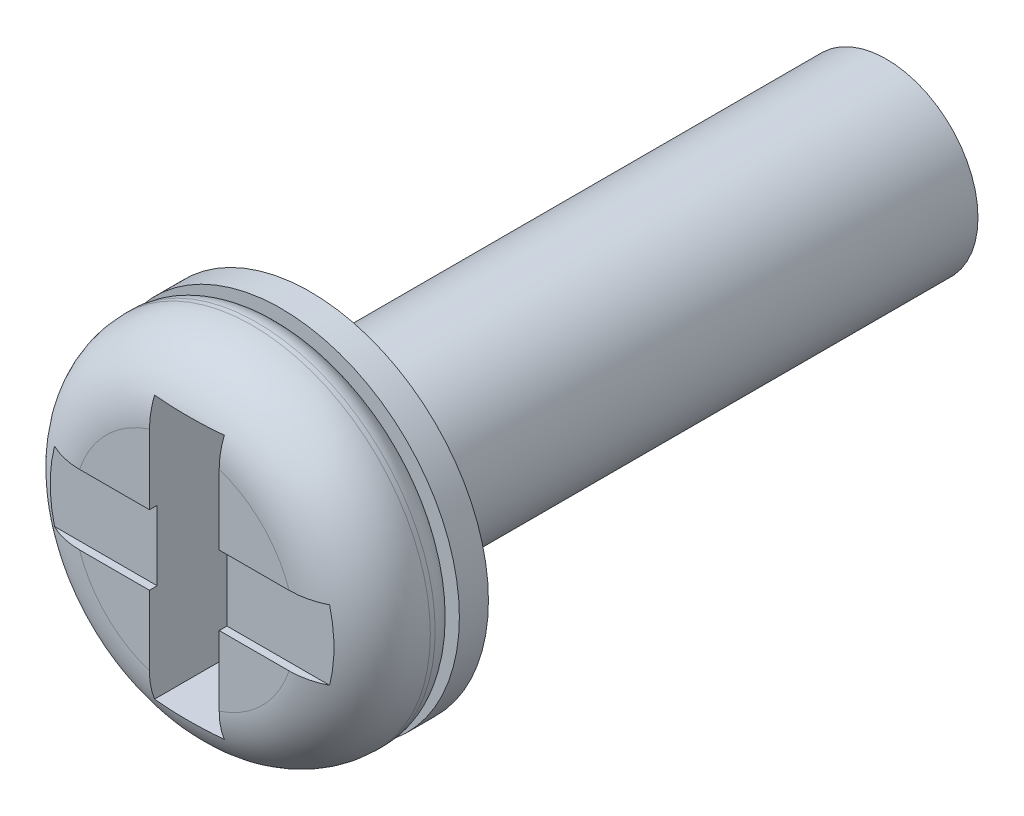
ISO-10303-21;
HEADER;
FILE_DESCRIPTION(('STEP AP214'),'2;1');
FILE_NAME('part.step','',(''),(''),'','','');
FILE_SCHEMA(('AUTOMOTIVE_DESIGN { 1 0 10303 214 1 1 1 1 }'));
ENDSEC;
DATA;
#1=APPLICATION_CONTEXT('core data for automotive mechanical design processes');
#2=APPLICATION_PROTOCOL_DEFINITION('international standard','automotive_design',2000,#1);
#3=PRODUCT_CONTEXT('',#1,'mechanical');
#4=PRODUCT('Part','Part','',(#3));
#5=PRODUCT_RELATED_PRODUCT_CATEGORY('part','',(#4));
#6=PRODUCT_DEFINITION_FORMATION('','',#4);
#7=PRODUCT_DEFINITION_CONTEXT('part definition',#1,'design');
#8=PRODUCT_DEFINITION('design','',#6,#7);
#9=PRODUCT_DEFINITION_SHAPE('','',#8);
#10=(LENGTH_UNIT() NAMED_UNIT(*) SI_UNIT(.MILLI.,.METRE.));
#11=(NAMED_UNIT(*) PLANE_ANGLE_UNIT() SI_UNIT($,.RADIAN.));
#12=(NAMED_UNIT(*) SI_UNIT($,.STERADIAN.) SOLID_ANGLE_UNIT());
#13=UNCERTAINTY_MEASURE_WITH_UNIT(LENGTH_MEASURE(1.E-05),#10,'distance_accuracy_value','');
#14=(GEOMETRIC_REPRESENTATION_CONTEXT(3) GLOBAL_UNCERTAINTY_ASSIGNED_CONTEXT((#13)) GLOBAL_UNIT_ASSIGNED_CONTEXT((#10,
#11,#12)) REPRESENTATION_CONTEXT('',''));
#15=CARTESIAN_POINT('',(0.,0.,0.));
#16=DIRECTION('',(0.,0.,1.));
#17=DIRECTION('',(1.,0.,0.));
#18=AXIS2_PLACEMENT_3D('',#15,#16,#17);
#19=CARTESIAN_POINT('',(-15.875,-0.9144,5.12843787721123));
#20=DIRECTION('',(0.,-1.,0.));
#21=DIRECTION('',(0.,0.,-1.));
#22=AXIS2_PLACEMENT_3D('',#19,#20,#21);
#23=PLANE('',#22);
#24=DIRECTION('',(0.,0.,1.));
#25=VECTOR('',#24,1.);
#26=CARTESIAN_POINT('',(-0.9144,-0.9144,0.127));
#27=LINE('',#26,#25);
#28=CARTESIAN_POINT('',(-0.9144,-0.9144,2.54));
#29=VERTEX_POINT('',#28);
#30=CARTESIAN_POINT('',(-0.9144,-0.9144,2.3368));
#31=VERTEX_POINT('',#30);
#32=EDGE_CURVE('E135',#29,#31,#27,.F.);
#33=ORIENTED_EDGE('',*,*,#32,.T.);
#34=DIRECTION('',(-1.,0.,0.));
#35=VECTOR('',#34,1.);
#36=CARTESIAN_POINT('',(-15.875,-0.9144,2.3368));
#37=LINE('',#36,#35);
#38=CARTESIAN_POINT('',(-3.60690043816391,-0.9144,2.3368));
#39=VERTEX_POINT('',#38);
#40=EDGE_CURVE('E133',#31,#39,#37,.T.);
#41=ORIENTED_EDGE('',*,*,#40,.T.);
#42=CARTESIAN_POINT('',(-2.74743007190356,-0.914400000000001,2.54));
#43=CARTESIAN_POINT('',(-2.80124673868457,-0.9144,2.54000705825152));
#44=CARTESIAN_POINT('',(-2.85506989182567,-0.9144,2.53780042515122));
#45=CARTESIAN_POINT('',(-2.96238479467093,-0.9144,2.52892804109375));
#46=CARTESIAN_POINT('',(-3.01587628400418,-0.9144,2.52225914777365));
#47=CARTESIAN_POINT('',(-3.12106363377137,-0.9144,2.50460544533486));
#48=CARTESIAN_POINT('',(-3.17277412875175,-0.9144,2.49370794851066));
#49=CARTESIAN_POINT('',(-3.27507163677224,-0.9144,2.46762392294327));
#50=CARTESIAN_POINT('',(-3.32565933784672,-0.914400000000002,2.4524401037243));
#51=CARTESIAN_POINT('',(-3.4149723127263,-0.914400000000001,2.42144536094071));
#52=CARTESIAN_POINT('',(-3.45397342316214,-0.914400000000001,2.40642399511154));
#53=CARTESIAN_POINT('',(-3.53117351121653,-0.914399999999999,2.37364827885271));
#54=CARTESIAN_POINT('',(-3.56936372131527,-0.914399999999999,2.35587328129123));
#55=CARTESIAN_POINT('',(-3.60690043816391,-0.914400000000001,2.3368));
#56=B_SPLINE_CURVE_WITH_KNOTS('',3,(#42,#43,#44,#45,#46,#47,#48,#49,#50,#51,#52,#53,#54,#55),
.UNSPECIFIED.,.F.,.F.,(4,2,2,2,2,2,4),(0.,0.161414756760769,0.322943303013079,0.481300299496753,
0.63955741665452,0.76484678036644,0.891125630689563),.UNSPECIFIED.);
#57=CARTESIAN_POINT('',(-2.74743007190356,-0.9144,2.54));
#58=VERTEX_POINT('',#57);
#59=EDGE_CURVE('E122',#58,#39,#56,.T.);
#60=ORIENTED_EDGE('',*,*,#59,.F.);
#61=DIRECTION('',(-1.,0.,0.));
#62=VECTOR('',#61,1.);
#63=CARTESIAN_POINT('',(-4.6736,-0.9144,2.54));
#64=LINE('',#63,#62);
#65=EDGE_CURVE('E443',#58,#29,#64,.F.);
#66=ORIENTED_EDGE('',*,*,#65,.T.);
#67=EDGE_LOOP('',(#33,#41,#60,#66));
#68=FACE_BOUND('',#67,.T.);
#69=ADVANCED_FACE('F17',(#68),#23,.F.);
#70=CARTESIAN_POINT('',(-15.875,0.9144,5.12843787721123));
#71=DIRECTION('',(0.,1.,0.));
#72=DIRECTION('',(0.,0.,1.));
#73=AXIS2_PLACEMENT_3D('',#70,#71,#72);
#74=PLANE('',#73);
#75=DIRECTION('',(0.,0.,1.));
#76=VECTOR('',#75,1.);
#77=CARTESIAN_POINT('',(-0.9144,0.9144,0.127));
#78=LINE('',#77,#76);
#79=CARTESIAN_POINT('',(-0.9144,0.9144,2.3368));
#80=VERTEX_POINT('',#79);
#81=CARTESIAN_POINT('',(-0.9144,0.9144,2.54));
#82=VERTEX_POINT('',#81);
#83=EDGE_CURVE('E397',#80,#82,#78,.T.);
#84=ORIENTED_EDGE('',*,*,#83,.T.);
#85=DIRECTION('',(-1.,0.,0.));
#86=VECTOR('',#85,1.);
#87=CARTESIAN_POINT('',(-4.6736,0.9144,2.54));
#88=LINE('',#87,#86);
#89=CARTESIAN_POINT('',(-2.74743007190356,0.9144,2.54));
#90=VERTEX_POINT('',#89);
#91=EDGE_CURVE('E267',#82,#90,#88,.T.);
#92=ORIENTED_EDGE('',*,*,#91,.T.);
#93=CARTESIAN_POINT('',(-3.60690043816391,0.9144,2.3368));
#94=CARTESIAN_POINT('',(-3.55891645104512,0.9144,2.36118690758039));
#95=CARTESIAN_POINT('',(-3.50985783046448,0.9144,2.38344745394048));
#96=CARTESIAN_POINT('',(-3.40998380886696,0.9144,2.42362551008678));
#97=CARTESIAN_POINT('',(-3.35916814716329,0.9144,2.44154237222722));
#98=CARTESIAN_POINT('',(-3.25717188222844,0.9144,2.47263520880558));
#99=CARTESIAN_POINT('',(-3.20601684770011,0.9144,2.48589530386988));
#100=CARTESIAN_POINT('',(-3.10280179400812,0.9144,2.50810186849966));
#101=CARTESIAN_POINT('',(-3.05074219654593,0.9144,2.51705029504972));
#102=CARTESIAN_POINT('',(-2.95697071674521,0.9144,2.52922469796127));
#103=CARTESIAN_POINT('',(-2.91536088685642,0.9144,2.53325416482456));
#104=CARTESIAN_POINT('',(-2.83164534434831,0.9144,2.53865322247059));
#105=CARTESIAN_POINT('',(-2.78953828573834,0.9144,2.54000199550921));
#106=CARTESIAN_POINT('',(-2.74743007190356,0.9144,2.54));
#107=B_SPLINE_CURVE_WITH_KNOTS('',3,(#93,#94,#95,#96,#97,#98,#99,#100,#101,#102,#103,#104,#105,
#106),.UNSPECIFIED.,.F.,.F.,(4,2,2,2,2,2,4),(0.,0.161417077600654,0.32285820779726,
0.481211596395386,0.639493043531029,0.764822991615106,0.891122482809679),.UNSPECIFIED.);
#108=CARTESIAN_POINT('',(-3.60690043816391,0.9144,2.3368));
#109=VERTEX_POINT('',#108);
#110=EDGE_CURVE('E117',#109,#90,#107,.T.);
#111=ORIENTED_EDGE('',*,*,#110,.F.);
#112=DIRECTION('',(-1.,0.,0.));
#113=VECTOR('',#112,1.);
#114=CARTESIAN_POINT('',(-15.875,0.9144,2.3368));
#115=LINE('',#114,#113);
#116=EDGE_CURVE('E143',#109,#80,#115,.F.);
#117=ORIENTED_EDGE('',*,*,#116,.T.);
#118=EDGE_LOOP('',(#84,#92,#111,#117));
#119=FACE_BOUND('',#118,.T.);
#120=ADVANCED_FACE('F462',(#119),#74,.F.);
#121=CARTESIAN_POINT('',(-0.9144,-3.4544,0.127));
#122=DIRECTION('',(0.,0.,-1.));
#123=DIRECTION('',(-1.,0.,0.));
#124=AXIS2_PLACEMENT_3D('',#121,#122,#123);
#125=PLANE('',#124);
#126=DIRECTION('',(0.,1.,0.));
#127=VECTOR('',#126,1.);
#128=CARTESIAN_POINT('',(0.9144,-3.4544,0.127));
#129=LINE('',#128,#127);
#130=CARTESIAN_POINT('',(0.9144,-3.4544,0.127));
#131=VERTEX_POINT('',#130);
#132=CARTESIAN_POINT('',(0.9144,3.4544,0.127));
#133=VERTEX_POINT('',#132);
#134=EDGE_CURVE('E407',#131,#133,#129,.T.);
#135=ORIENTED_EDGE('',*,*,#134,.T.);
#136=DIRECTION('',(1.,0.,0.));
#137=VECTOR('',#136,1.);
#138=CARTESIAN_POINT('',(-0.9144,3.4544,0.127));
#139=LINE('',#138,#137);
#140=CARTESIAN_POINT('',(-0.9144,3.4544,0.127));
#141=VERTEX_POINT('',#140);
#142=EDGE_CURVE('E413',#133,#141,#139,.F.);
#143=ORIENTED_EDGE('',*,*,#142,.T.);
#144=DIRECTION('',(0.,1.,0.));
#145=VECTOR('',#144,1.);
#146=CARTESIAN_POINT('',(-0.9144,-3.4544,0.127));
#147=LINE('',#146,#145);
#148=CARTESIAN_POINT('',(-0.9144,-3.4544,0.127));
#149=VERTEX_POINT('',#148);
#150=EDGE_CURVE('E418',#141,#149,#147,.F.);
#151=ORIENTED_EDGE('',*,*,#150,.T.);
#152=DIRECTION('',(1.,0.,0.));
#153=VECTOR('',#152,1.);
#154=CARTESIAN_POINT('',(0.9144,-3.4544,0.127));
#155=LINE('',#154,#153);
#156=EDGE_CURVE('E390',#149,#131,#155,.T.);
#157=ORIENTED_EDGE('',*,*,#156,.T.);
#158=EDGE_LOOP('',(#135,#143,#151,#157));
#159=FACE_BOUND('',#158,.T.);
#160=ADVANCED_FACE('F464',(#159),#125,.F.);
#161=CARTESIAN_POINT('',(-0.9144,-3.4544,0.127));
#162=DIRECTION('',(-1.,0.,0.));
#163=DIRECTION('',(0.,0.,1.));
#164=AXIS2_PLACEMENT_3D('',#161,#162,#163);
#165=PLANE('',#164);
#166=DIRECTION('',(0.,0.,1.));
#167=VECTOR('',#166,1.);
#168=CARTESIAN_POINT('',(-0.9144,-3.4544,0.127));
#169=LINE('',#168,#167);
#170=CARTESIAN_POINT('',(-0.914399999999999,-3.454399999999,2.40574738360132));
#171=VERTEX_POINT('',#170);
#172=EDGE_CURVE('E393',#171,#149,#169,.F.);
#173=ORIENTED_EDGE('',*,*,#172,.T.);
#174=ORIENTED_EDGE('',*,*,#150,.F.);
#175=DIRECTION('',(0.,0.,1.));
#176=VECTOR('',#175,1.);
#177=CARTESIAN_POINT('',(-0.9144,3.4544,0.127));
#178=LINE('',#177,#176);
#179=CARTESIAN_POINT('',(-0.9144,3.4544,2.405747383598));
#180=VERTEX_POINT('',#179);
#181=EDGE_CURVE('E415',#141,#180,#178,.T.);
#182=ORIENTED_EDGE('',*,*,#181,.T.);
#183=CARTESIAN_POINT('',(-0.9144,2.74743007190356,2.54));
#184=CARTESIAN_POINT('',(-0.9144,2.77782783699448,2.54000067495229));
#185=CARTESIAN_POINT('',(-0.9144,2.80822620787016,2.53929820419313));
#186=CARTESIAN_POINT('',(-0.9144,2.86875658083111,2.5364871429764));
#187=CARTESIAN_POINT('',(-0.9144,2.89888901639095,2.53438786777013));
#188=CARTESIAN_POINT('',(-0.9144,2.95888873326815,2.52879608232479));
#189=CARTESIAN_POINT('',(-0.9144,2.98875659775195,2.52530984174055));
#190=CARTESIAN_POINT('',(-0.9144,3.04822745086466,2.51694971098744));
#191=CARTESIAN_POINT('',(-0.9144,3.07783089124277,2.5120790367594));
#192=CARTESIAN_POINT('',(-0.9144,3.13677910617899,2.50094561459818));
#193=CARTESIAN_POINT('',(-0.9144,3.16612384577094,2.49468268139684));
#194=CARTESIAN_POINT('',(-0.9144,3.22454683615433,2.48075341983046));
#195=CARTESIAN_POINT('',(-0.9144,3.25362435737859,2.47308402991632));
#196=CARTESIAN_POINT('',(-0.9144,3.31150714837012,2.45632106613781));
#197=CARTESIAN_POINT('',(-0.9144,3.34031061953994,2.44722127778654));
#198=CARTESIAN_POINT('',(-0.9144,3.39763717351378,2.42756849256347));
#199=CARTESIAN_POINT('',(-0.9144,3.42615700144024,2.41700600231854));
#200=CARTESIAN_POINT('',(-0.914400000000001,3.4544,2.40574738359799));
#201=B_SPLINE_CURVE_WITH_KNOTS('',3,(#183,#184,#185,#186,#187,#188,#189,#190,#191,#192,#193,
#194,#195,#196,#197,#198,#199,#200),.UNSPECIFIED.,.F.,.F.,(4,2,2,2,2,2,2,2,4),(0.,
0.0911860354566408,0.181769968524148,0.271948994694242,0.361920229771637,0.451903444512021,
0.54208490959823,0.632669594000315,0.723872457449047),.UNSPECIFIED.);
#202=CARTESIAN_POINT('',(-0.9144,2.74743007190356,2.54));
#203=VERTEX_POINT('',#202);
#204=EDGE_CURVE('E404',#203,#180,#201,.T.);
#205=ORIENTED_EDGE('',*,*,#204,.F.);
#206=DIRECTION('',(0.,1.,0.));
#207=VECTOR('',#206,1.);
#208=CARTESIAN_POINT('',(-0.9144,0.,2.54));
#209=LINE('',#208,#207);
#210=EDGE_CURVE('E139',#203,#82,#209,.F.);
#211=ORIENTED_EDGE('',*,*,#210,.T.);
#212=ORIENTED_EDGE('',*,*,#83,.F.);
#213=DIRECTION('',(0.,1.,0.));
#214=VECTOR('',#213,1.);
#215=CARTESIAN_POINT('',(-0.914399999999999,-0.9144,2.3368));
#216=LINE('',#215,#214);
#217=EDGE_CURVE('E140',#80,#31,#216,.F.);
#218=ORIENTED_EDGE('',*,*,#217,.T.);
#219=ORIENTED_EDGE('',*,*,#32,.F.);
#220=DIRECTION('',(0.,1.,0.));
#221=VECTOR('',#220,1.);
#222=CARTESIAN_POINT('',(-0.9144,0.,2.54));
#223=LINE('',#222,#221);
#224=CARTESIAN_POINT('',(-0.9144,-2.74743007190356,2.54));
#225=VERTEX_POINT('',#224);
#226=EDGE_CURVE('E293',#29,#225,#223,.F.);
#227=ORIENTED_EDGE('',*,*,#226,.T.);
#228=CARTESIAN_POINT('',(-0.914399999999998,-3.45439999999799,2.40574738359879));
#229=CARTESIAN_POINT('',(-0.914399999999999,-3.42615700143831,2.41700600231928));
#230=CARTESIAN_POINT('',(-0.9144,-3.39763717351192,2.42756849256414));
#231=CARTESIAN_POINT('',(-0.9144,-3.34031061953823,2.44722127778709));
#232=CARTESIAN_POINT('',(-0.9144,-3.31150714836849,2.45632106613831));
#233=CARTESIAN_POINT('',(-0.9144,-3.25362435737712,2.47308402991672));
#234=CARTESIAN_POINT('',(-0.9144,-3.22454683615294,2.48075341983081));
#235=CARTESIAN_POINT('',(-0.9144,-3.16612384576971,2.49468268139711));
#236=CARTESIAN_POINT('',(-0.9144,-3.13677910617785,2.50094561459841));
#237=CARTESIAN_POINT('',(-0.9144,-3.07783089124179,2.51207903675957));
#238=CARTESIAN_POINT('',(-0.9144,-3.04822745086377,2.51694971098757));
#239=CARTESIAN_POINT('',(-0.9144,-2.98875659775123,2.52530984174064));
#240=CARTESIAN_POINT('',(-0.9144,-2.95888873326752,2.52879608232486));
#241=CARTESIAN_POINT('',(-0.9144,-2.8988890163905,2.53438786777017));
#242=CARTESIAN_POINT('',(-0.9144,-2.86875658083075,2.53648714297643));
#243=CARTESIAN_POINT('',(-0.9144,-2.80822620786997,2.53929820419314));
#244=CARTESIAN_POINT('',(-0.9144,-2.77782783699439,2.54000067495229));
#245=CARTESIAN_POINT('',(-0.914399999999999,-2.74743007190356,2.54));
#246=B_SPLINE_CURVE_WITH_KNOTS('',3,(#228,#229,#230,#231,#232,#233,#234,#235,#236,#237,#238,
#239,#240,#241,#242,#243,#244,#245),.UNSPECIFIED.,.F.,.F.,(4,2,2,2,2,2,2,2,4),(0.,
0.0912028634484563,0.18178754785027,0.271969012936211,0.36195222767633,0.45192346275346,
0.542102488923286,0.632686421990523,0.723872457446887),.UNSPECIFIED.);
#247=EDGE_CURVE('E420',#171,#225,#246,.T.);
#248=ORIENTED_EDGE('',*,*,#247,.F.);
#249=EDGE_LOOP('',(#173,#174,#182,#205,#211,#212,#218,#219,#227,#248));
#250=FACE_BOUND('',#249,.T.);
#251=ADVANCED_FACE('F457',(#250),#165,.F.);
#252=CARTESIAN_POINT('',(-15.875,0.9144,5.12843787721123));
#253=DIRECTION('',(0.,1.,0.));
#254=DIRECTION('',(0.,0.,1.));
#255=AXIS2_PLACEMENT_3D('',#252,#253,#254);
#256=PLANE('',#255);
#257=DIRECTION('',(0.,0.,1.));
#258=VECTOR('',#257,1.);
#259=CARTESIAN_POINT('',(0.9144,0.9144,0.127));
#260=LINE('',#259,#258);
#261=CARTESIAN_POINT('',(0.9144,0.9144,2.54));
#262=VERTEX_POINT('',#261);
#263=CARTESIAN_POINT('',(0.9144,0.9144,2.3368));
#264=VERTEX_POINT('',#263);
#265=EDGE_CURVE('E423',#262,#264,#260,.F.);
#266=ORIENTED_EDGE('',*,*,#265,.T.);
#267=DIRECTION('',(-1.,0.,0.));
#268=VECTOR('',#267,1.);
#269=CARTESIAN_POINT('',(-15.875,0.9144,2.3368));
#270=LINE('',#269,#268);
#271=CARTESIAN_POINT('',(3.60690043816391,0.9144,2.3368));
#272=VERTEX_POINT('',#271);
#273=EDGE_CURVE('E206',#264,#272,#270,.F.);
#274=ORIENTED_EDGE('',*,*,#273,.T.);
#275=CARTESIAN_POINT('',(2.74743007190356,0.914400000000001,2.54));
#276=CARTESIAN_POINT('',(2.80124673868457,0.9144,2.54000705825152));
#277=CARTESIAN_POINT('',(2.85506989182567,0.9144,2.53780042515122));
#278=CARTESIAN_POINT('',(2.96238479467093,0.9144,2.52892804109375));
#279=CARTESIAN_POINT('',(3.01587628400418,0.9144,2.52225914777365));
#280=CARTESIAN_POINT('',(3.12106363377137,0.9144,2.50460544533486));
#281=CARTESIAN_POINT('',(3.17277412875175,0.9144,2.49370794851066));
#282=CARTESIAN_POINT('',(3.27507163677224,0.9144,2.46762392294327));
#283=CARTESIAN_POINT('',(3.32565933784672,0.914400000000001,2.4524401037243));
#284=CARTESIAN_POINT('',(3.4149723127263,0.914400000000001,2.42144536094071));
#285=CARTESIAN_POINT('',(3.45397342316214,0.9144,2.40642399511154));
#286=CARTESIAN_POINT('',(3.53117351121653,0.9144,2.37364827885271));
#287=CARTESIAN_POINT('',(3.56936372131527,0.914399999999999,2.35587328129123));
#288=CARTESIAN_POINT('',(3.60690043816391,0.9144,2.3368));
#289=B_SPLINE_CURVE_WITH_KNOTS('',3,(#275,#276,#277,#278,#279,#280,#281,#282,#283,#284,#285,
#286,#287,#288),.UNSPECIFIED.,.F.,.F.,(4,2,2,2,2,2,4),(0.,0.161414756760769,0.322943303013079,
0.481300299496752,0.639557416654519,0.76484678036644,0.891125630689563),.UNSPECIFIED.);
#290=CARTESIAN_POINT('',(2.74743007190356,0.9144,2.54));
#291=VERTEX_POINT('',#290);
#292=EDGE_CURVE('E410',#291,#272,#289,.T.);
#293=ORIENTED_EDGE('',*,*,#292,.F.);
#294=DIRECTION('',(-1.,0.,0.));
#295=VECTOR('',#294,1.);
#296=CARTESIAN_POINT('',(-4.6736,0.9144,2.54));
#297=LINE('',#296,#295);
#298=EDGE_CURVE('E538',#291,#262,#297,.T.);
#299=ORIENTED_EDGE('',*,*,#298,.T.);
#300=EDGE_LOOP('',(#266,#274,#293,#299));
#301=FACE_BOUND('',#300,.T.);
#302=ADVANCED_FACE('F489',(#301),#256,.F.);
#303=CARTESIAN_POINT('',(0.9144,-3.4544,0.127));
#304=DIRECTION('',(1.,0.,0.));
#305=DIRECTION('',(0.,1.,0.));
#306=AXIS2_PLACEMENT_3D('',#303,#304,#305);
#307=PLANE('',#306);
#308=DIRECTION('',(0.,1.,0.));
#309=VECTOR('',#308,1.);
#310=CARTESIAN_POINT('',(0.9144,0.,2.54));
#311=LINE('',#310,#309);
#312=CARTESIAN_POINT('',(0.9144,-2.74743007190356,2.54));
#313=VERTEX_POINT('',#312);
#314=CARTESIAN_POINT('',(0.9144,-0.9144,2.54));
#315=VERTEX_POINT('',#314);
#316=EDGE_CURVE('E201',#313,#315,#311,.T.);
#317=ORIENTED_EDGE('',*,*,#316,.T.);
#318=DIRECTION('',(0.,0.,-1.));
#319=VECTOR('',#318,1.);
#320=CARTESIAN_POINT('',(0.914399999999999,-0.9144,5.12843787721123));
#321=LINE('',#320,#319);
#322=CARTESIAN_POINT('',(0.914399999999999,-0.9144,2.3368));
#323=VERTEX_POINT('',#322);
#324=EDGE_CURVE('E432',#315,#323,#321,.T.);
#325=ORIENTED_EDGE('',*,*,#324,.T.);
#326=DIRECTION('',(0.,1.,0.));
#327=VECTOR('',#326,1.);
#328=CARTESIAN_POINT('',(0.914399999999999,-0.9144,2.3368));
#329=LINE('',#328,#327);
#330=EDGE_CURVE('E220',#323,#264,#329,.T.);
#331=ORIENTED_EDGE('',*,*,#330,.T.);
#332=ORIENTED_EDGE('',*,*,#265,.F.);
#333=DIRECTION('',(0.,1.,0.));
#334=VECTOR('',#333,1.);
#335=CARTESIAN_POINT('',(0.9144,0.,2.54));
#336=LINE('',#335,#334);
#337=CARTESIAN_POINT('',(0.9144,2.74743007190356,2.54));
#338=VERTEX_POINT('',#337);
#339=EDGE_CURVE('E226',#262,#338,#336,.T.);
#340=ORIENTED_EDGE('',*,*,#339,.T.);
#341=CARTESIAN_POINT('',(0.914400000000001,3.45440000000004,2.40574738359798));
#342=CARTESIAN_POINT('',(0.914400000000001,3.42615700144028,2.41700600231853));
#343=CARTESIAN_POINT('',(0.9144,3.39763717351382,2.42756849256346));
#344=CARTESIAN_POINT('',(0.9144,3.34031061953997,2.44722127778652));
#345=CARTESIAN_POINT('',(0.9144,3.31150714837015,2.4563210661378));
#346=CARTESIAN_POINT('',(0.9144,3.25362435737862,2.47308402991631));
#347=CARTESIAN_POINT('',(0.9144,3.22454683615436,2.48075341983045));
#348=CARTESIAN_POINT('',(0.9144,3.16612384577096,2.49468268139684));
#349=CARTESIAN_POINT('',(0.9144,3.13677910617901,2.50094561459818));
#350=CARTESIAN_POINT('',(0.9144,3.07783089124278,2.5120790367594));
#351=CARTESIAN_POINT('',(0.9144,3.04822745086468,2.51694971098743));
#352=CARTESIAN_POINT('',(0.9144,2.98875659775196,2.52530984174055));
#353=CARTESIAN_POINT('',(0.9144,2.95888873326817,2.52879608232479));
#354=CARTESIAN_POINT('',(0.9144,2.89888901639096,2.53438786777013));
#355=CARTESIAN_POINT('',(0.9144,2.86875658083112,2.5364871429764));
#356=CARTESIAN_POINT('',(0.9144,2.80822620787016,2.53929820419313));
#357=CARTESIAN_POINT('',(0.9144,2.77782783699448,2.54000067495229));
#358=CARTESIAN_POINT('',(0.9144,2.74743007190356,2.54));
#359=B_SPLINE_CURVE_WITH_KNOTS('',3,(#341,#342,#343,#344,#345,#346,#347,#348,#349,#350,#351,
#352,#353,#354,#355,#356,#357,#358),.UNSPECIFIED.,.F.,.F.,(4,2,2,2,2,2,2,2,4),(0.,
0.0912028634487381,0.181787547850828,0.271969012937042,0.361952227677431,0.451923462754831,
0.54210248892493,0.632686421992442,0.723872457449088),.UNSPECIFIED.);
#360=CARTESIAN_POINT('',(0.9144,3.45440000000002,2.40574738359793));
#361=VERTEX_POINT('',#360);
#362=EDGE_CURVE('E409',#361,#338,#359,.T.);
#363=ORIENTED_EDGE('',*,*,#362,.F.);
#364=DIRECTION('',(0.,0.,1.));
#365=VECTOR('',#364,1.);
#366=CARTESIAN_POINT('',(0.9144,3.4544,0.127));
#367=LINE('',#366,#365);
#368=EDGE_CURVE('E274',#361,#133,#367,.F.);
#369=ORIENTED_EDGE('',*,*,#368,.T.);
#370=ORIENTED_EDGE('',*,*,#134,.F.);
#371=DIRECTION('',(0.,0.,1.));
#372=VECTOR('',#371,1.);
#373=CARTESIAN_POINT('',(0.9144,-3.4544,0.127));
#374=LINE('',#373,#372);
#375=CARTESIAN_POINT('',(0.914400000000001,-3.4544,2.40574738359799));
#376=VERTEX_POINT('',#375);
#377=EDGE_CURVE('E392',#131,#376,#374,.T.);
#378=ORIENTED_EDGE('',*,*,#377,.T.);
#379=CARTESIAN_POINT('',(0.914400000000001,-2.74743007190356,2.54));
#380=CARTESIAN_POINT('',(0.9144,-2.77782783699448,2.54000067495229));
#381=CARTESIAN_POINT('',(0.9144,-2.80822620787016,2.53929820419313));
#382=CARTESIAN_POINT('',(0.9144,-2.86875658083111,2.5364871429764));
#383=CARTESIAN_POINT('',(0.9144,-2.89888901639096,2.53438786777013));
#384=CARTESIAN_POINT('',(0.9144,-2.95888873326815,2.52879608232479));
#385=CARTESIAN_POINT('',(0.9144,-2.98875659775195,2.52530984174055));
#386=CARTESIAN_POINT('',(0.9144,-3.04822745086466,2.51694971098743));
#387=CARTESIAN_POINT('',(0.9144,-3.07783089124277,2.5120790367594));
#388=CARTESIAN_POINT('',(0.9144,-3.13677910617899,2.50094561459818));
#389=CARTESIAN_POINT('',(0.9144,-3.16612384577094,2.49468268139684));
#390=CARTESIAN_POINT('',(0.9144,-3.22454683615433,2.48075341983046));
#391=CARTESIAN_POINT('',(0.9144,-3.2536243573786,2.47308402991632));
#392=CARTESIAN_POINT('',(0.9144,-3.31150714837012,2.45632106613781));
#393=CARTESIAN_POINT('',(0.9144,-3.34031061953994,2.44722127778653));
#394=CARTESIAN_POINT('',(0.9144,-3.39763717351379,2.42756849256347));
#395=CARTESIAN_POINT('',(0.914400000000001,-3.42615700144024,2.41700600231854));
#396=CARTESIAN_POINT('',(0.914400000000004,-3.4544,2.40574738359799));
#397=B_SPLINE_CURVE_WITH_KNOTS('',3,(#379,#380,#381,#382,#383,#384,#385,#386,#387,#388,#389,
#390,#391,#392,#393,#394,#395,#396),.UNSPECIFIED.,.F.,.F.,(4,2,2,2,2,2,2,2,4),(0.,
0.0911860354566413,0.181769968524149,0.271948994694243,0.361920229771639,0.451903444512024,
0.542084909598232,0.632669594000318,0.723872457449052),.UNSPECIFIED.);
#398=EDGE_CURVE('E425',#313,#376,#397,.T.);
#399=ORIENTED_EDGE('',*,*,#398,.F.);
#400=EDGE_LOOP('',(#317,#325,#331,#332,#340,#363,#369,#370,#378,#399));
#401=FACE_BOUND('',#400,.T.);
#402=ADVANCED_FACE('F511',(#401),#307,.F.);
#403=CARTESIAN_POINT('',(-15.875,-0.9144,5.12843787721123));
#404=DIRECTION('',(0.,-1.,0.));
#405=DIRECTION('',(0.,0.,-1.));
#406=AXIS2_PLACEMENT_3D('',#403,#404,#405);
#407=PLANE('',#406);
#408=ORIENTED_EDGE('',*,*,#324,.F.);
#409=DIRECTION('',(-1.,0.,0.));
#410=VECTOR('',#409,1.);
#411=CARTESIAN_POINT('',(-4.6736,-0.9144,2.54));
#412=LINE('',#411,#410);
#413=CARTESIAN_POINT('',(2.74743007190356,-0.9144,2.54));
#414=VERTEX_POINT('',#413);
#415=EDGE_CURVE('E162',#315,#414,#412,.F.);
#416=ORIENTED_EDGE('',*,*,#415,.T.);
#417=CARTESIAN_POINT('',(3.60690043816391,-0.914399999999999,2.3368));
#418=CARTESIAN_POINT('',(3.55891645104512,-0.914399999999999,2.36118690758039));
#419=CARTESIAN_POINT('',(3.50985783046448,-0.9144,2.38344745394048));
#420=CARTESIAN_POINT('',(3.40998380886696,-0.9144,2.42362551008677));
#421=CARTESIAN_POINT('',(3.35916814716329,-0.9144,2.44154237222722));
#422=CARTESIAN_POINT('',(3.25717188222844,-0.9144,2.47263520880558));
#423=CARTESIAN_POINT('',(3.20601684770011,-0.9144,2.48589530386988));
#424=CARTESIAN_POINT('',(3.10280179400813,-0.9144,2.50810186849966));
#425=CARTESIAN_POINT('',(3.05074219654593,-0.914400000000001,2.51705029504972));
#426=CARTESIAN_POINT('',(2.95697071674521,-0.914400000000001,2.52922469796127));
#427=CARTESIAN_POINT('',(2.91536088685642,-0.914400000000001,2.53325416482456));
#428=CARTESIAN_POINT('',(2.83164534434831,-0.914399999999999,2.53865322247059));
#429=CARTESIAN_POINT('',(2.78953828573834,-0.914399999999999,2.54000199550921));
#430=CARTESIAN_POINT('',(2.74743007190356,-0.914399999999999,2.54));
#431=B_SPLINE_CURVE_WITH_KNOTS('',3,(#417,#418,#419,#420,#421,#422,#423,#424,#425,#426,#427,
#428,#429,#430),.UNSPECIFIED.,.F.,.F.,(4,2,2,2,2,2,4),(0.,0.161417077600654,0.32285820779726,
0.481211596395386,0.639493043531029,0.764822991615107,0.891122482809679),.UNSPECIFIED.);
#432=CARTESIAN_POINT('',(3.60690043816391,-0.914399999999999,2.3368));
#433=VERTEX_POINT('',#432);
#434=EDGE_CURVE('E40',#433,#414,#431,.T.);
#435=ORIENTED_EDGE('',*,*,#434,.F.);
#436=DIRECTION('',(-1.,0.,0.));
#437=VECTOR('',#436,1.);
#438=CARTESIAN_POINT('',(-15.875,-0.9144,2.3368));
#439=LINE('',#438,#437);
#440=EDGE_CURVE('E223',#433,#323,#439,.T.);
#441=ORIENTED_EDGE('',*,*,#440,.T.);
#442=EDGE_LOOP('',(#408,#416,#435,#441));
#443=FACE_BOUND('',#442,.T.);
#444=ADVANCED_FACE('F316',(#443),#407,.F.);
#445=CARTESIAN_POINT('',(0.9144,-3.4544,0.127));
#446=DIRECTION('',(0.,-1.,0.));
#447=DIRECTION('',(1.,0.,0.));
#448=AXIS2_PLACEMENT_3D('',#445,#446,#447);
#449=PLANE('',#448);
#450=ORIENTED_EDGE('',*,*,#377,.F.);
#451=ORIENTED_EDGE('',*,*,#156,.F.);
#452=ORIENTED_EDGE('',*,*,#172,.F.);
#453=CARTESIAN_POINT('',(0.914400000000002,-3.4544,2.40574738359799));
#454=CARTESIAN_POINT('',(0.838326620347482,-3.4544,2.41375386524558));
#455=CARTESIAN_POINT('',(0.762129093466846,-3.4544,2.42047259083492));
#456=CARTESIAN_POINT('',(0.609713865472113,-3.4544,2.43165333972104));
#457=CARTESIAN_POINT('',(0.533496483020473,-3.4544,2.43611966421837));
#458=CARTESIAN_POINT('',(0.381062818406396,-3.4544,2.44313865085265));
#459=CARTESIAN_POINT('',(0.304846630668728,-3.4544,2.44569345125005));
#460=CARTESIAN_POINT('',(0.152420280835091,-3.4544,2.44907661500853));
#461=CARTESIAN_POINT('',(0.0762101404176992,-3.4544,2.44990596905029));
#462=CARTESIAN_POINT('',(-0.0762101404170837,-3.4544,2.44990596905029));
#463=CARTESIAN_POINT('',(-0.152420280834475,-3.4544,2.44907661500854));
#464=CARTESIAN_POINT('',(-0.304846630668112,-3.4544,2.44569345125007));
#465=CARTESIAN_POINT('',(-0.381062818405781,-3.4544,2.44313865085268));
#466=CARTESIAN_POINT('',(-0.533496483019859,-3.4544,2.4361196642184));
#467=CARTESIAN_POINT('',(-0.609713865471499,-3.4544,2.43165333972108));
#468=CARTESIAN_POINT('',(-0.762129093466232,-3.4544,2.42047259083497));
#469=CARTESIAN_POINT('',(-0.838326620346869,-3.4544,2.41375386524564));
#470=CARTESIAN_POINT('',(-0.914399999999389,-3.4544,2.40574738359806));
#471=B_SPLINE_CURVE_WITH_KNOTS('',3,(#453,#454,#455,#456,#457,#458,#459,#460,#461,#462,#463,
#464,#465,#466,#467,#468,#469,#470),.UNSPECIFIED.,.F.,.F.,(4,2,2,2,2,2,2,2,4),(0.,
0.229453239946951,0.458466639341413,0.687223476220621,0.915848933998112,1.1444743917756,
1.37323122865481,1.60224462804927,1.83169786799622),.UNSPECIFIED.);
#472=EDGE_CURVE('E148',#376,#171,#471,.T.);
#473=ORIENTED_EDGE('',*,*,#472,.F.);
#474=EDGE_LOOP('',(#450,#451,#452,#473));
#475=FACE_BOUND('',#474,.T.);
#476=ADVANCED_FACE('F164',(#475),#449,.F.);
#477=CARTESIAN_POINT('',(-4.6736,0.,2.54));
#478=DIRECTION('',(0.,0.,-1.));
#479=DIRECTION('',(-1.,0.,0.));
#480=AXIS2_PLACEMENT_3D('',#477,#478,#479);
#481=PLANE('',#480);
#482=ORIENTED_EDGE('',*,*,#226,.F.);
#483=ORIENTED_EDGE('',*,*,#65,.F.);
#484=CARTESIAN_POINT('',(0.,0.,2.54));
#485=DIRECTION('',(0.,0.,-1.));
#486=DIRECTION('',(-0.31578947368421,-0.948829283016839,0.));
#487=AXIS2_PLACEMENT_3D('',#484,#485,#486);
#488=CIRCLE('',#487,2.8956);
#489=EDGE_CURVE('E128',#225,#58,#488,.T.);
#490=ORIENTED_EDGE('',*,*,#489,.F.);
#491=EDGE_LOOP('',(#482,#483,#490));
#492=FACE_BOUND('',#491,.T.);
#493=ADVANCED_FACE('F303',(#492),#481,.F.);
#494=CARTESIAN_POINT('',(-15.875,-0.9144,2.3368));
#495=DIRECTION('',(0.,0.,-1.));
#496=DIRECTION('',(-1.,0.,0.));
#497=AXIS2_PLACEMENT_3D('',#494,#495,#496);
#498=PLANE('',#497);
#499=ORIENTED_EDGE('',*,*,#217,.F.);
#500=ORIENTED_EDGE('',*,*,#116,.F.);
#501=CARTESIAN_POINT('',(0.,0.,2.3368));
#502=DIRECTION('',(0.,0.,-1.));
#503=DIRECTION('',(-1.,0.,0.));
#504=AXIS2_PLACEMENT_3D('',#501,#502,#503);
#505=CIRCLE('',#504,3.72100230191101);
#506=EDGE_CURVE('E126',#39,#109,#505,.T.);
#507=ORIENTED_EDGE('',*,*,#506,.F.);
#508=ORIENTED_EDGE('',*,*,#40,.F.);
#509=EDGE_LOOP('',(#499,#500,#507,#508));
#510=FACE_BOUND('',#509,.T.);
#511=ADVANCED_FACE('F142',(#510),#498,.F.);
#512=CARTESIAN_POINT('',(-4.6736,0.,2.54));
#513=DIRECTION('',(0.,0.,-1.));
#514=DIRECTION('',(-1.,0.,0.));
#515=AXIS2_PLACEMENT_3D('',#512,#513,#514);
#516=PLANE('',#515);
#517=ORIENTED_EDGE('',*,*,#210,.F.);
#518=CARTESIAN_POINT('',(0.,0.,2.54));
#519=DIRECTION('',(0.,0.,-1.));
#520=DIRECTION('',(-0.948829283016839,0.31578947368421,0.));
#521=AXIS2_PLACEMENT_3D('',#518,#519,#520);
#522=CIRCLE('',#521,2.8956);
#523=EDGE_CURVE('E144',#90,#203,#522,.T.);
#524=ORIENTED_EDGE('',*,*,#523,.F.);
#525=ORIENTED_EDGE('',*,*,#91,.F.);
#526=EDGE_LOOP('',(#517,#524,#525));
#527=FACE_BOUND('',#526,.T.);
#528=ADVANCED_FACE('F254',(#527),#516,.F.);
#529=CARTESIAN_POINT('',(-0.9144,3.4544,0.127));
#530=DIRECTION('',(0.,1.,0.));
#531=DIRECTION('',(0.,0.,1.));
#532=AXIS2_PLACEMENT_3D('',#529,#530,#531);
#533=PLANE('',#532);
#534=ORIENTED_EDGE('',*,*,#181,.F.);
#535=ORIENTED_EDGE('',*,*,#142,.F.);
#536=ORIENTED_EDGE('',*,*,#368,.F.);
#537=CARTESIAN_POINT('',(-0.9144,3.4544,2.40574738359799));
#538=CARTESIAN_POINT('',(-0.838326620347453,3.4544,2.41375386524559));
#539=CARTESIAN_POINT('',(-0.762129093466791,3.4544,2.42047259083493));
#540=CARTESIAN_POINT('',(-0.609713865472007,3.4544,2.43165333972105));
#541=CARTESIAN_POINT('',(-0.533496483020341,3.4544,2.43611966421838));
#542=CARTESIAN_POINT('',(-0.381062818406212,3.4544,2.44313865085266));
#543=CARTESIAN_POINT('',(-0.304846630668518,3.4544,2.44569345125006));
#544=CARTESIAN_POINT('',(-0.152420280834829,3.4544,2.44907661500853));
#545=CARTESIAN_POINT('',(-0.0762101404174118,3.4544,2.44990596905029));
#546=CARTESIAN_POINT('',(0.0762101404174227,3.4544,2.44990596905029));
#547=CARTESIAN_POINT('',(0.15242028083484,3.4544,2.44907661500853));
#548=CARTESIAN_POINT('',(0.304846630668529,3.4544,2.44569345125006));
#549=CARTESIAN_POINT('',(0.381062818406223,3.4544,2.44313865085266));
#550=CARTESIAN_POINT('',(0.533496483020352,3.4544,2.43611966421838));
#551=CARTESIAN_POINT('',(0.609713865472018,3.4544,2.43165333972105));
#552=CARTESIAN_POINT('',(0.762129093466802,3.4544,2.42047259083493));
#553=CARTESIAN_POINT('',(0.838326620347464,3.4544,2.41375386524559));
#554=CARTESIAN_POINT('',(0.914400000000011,3.4544,2.40574738359799));
#555=B_SPLINE_CURVE_WITH_KNOTS('',3,(#537,#538,#539,#540,#541,#542,#543,#544,#545,#546,#547,
#548,#549,#550,#551,#552,#553,#554),.UNSPECIFIED.,.F.,.F.,(4,2,2,2,2,2,2,2,4),(0.,
0.229453239947029,0.458466639341569,0.687223476220855,0.915848933998423,1.14447439177599,
1.37323122865528,1.60224462804982,1.83169786799685),.UNSPECIFIED.);
#556=EDGE_CURVE('E147',#180,#361,#555,.T.);
#557=ORIENTED_EDGE('',*,*,#556,.F.);
#558=EDGE_LOOP('',(#534,#535,#536,#557));
#559=FACE_BOUND('',#558,.T.);
#560=ADVANCED_FACE('F250',(#559),#533,.F.);
#561=CARTESIAN_POINT('',(-4.6736,0.,2.54));
#562=DIRECTION('',(0.,0.,-1.));
#563=DIRECTION('',(-1.,0.,0.));
#564=AXIS2_PLACEMENT_3D('',#561,#562,#563);
#565=PLANE('',#564);
#566=ORIENTED_EDGE('',*,*,#339,.F.);
#567=ORIENTED_EDGE('',*,*,#298,.F.);
#568=CARTESIAN_POINT('',(0.,0.,2.54));
#569=DIRECTION('',(0.,0.,-1.));
#570=DIRECTION('',(0.31578947368421,0.948829283016839,0.));
#571=AXIS2_PLACEMENT_3D('',#568,#569,#570);
#572=CIRCLE('',#571,2.8956);
#573=EDGE_CURVE('E235',#338,#291,#572,.T.);
#574=ORIENTED_EDGE('',*,*,#573,.F.);
#575=EDGE_LOOP('',(#566,#567,#574));
#576=FACE_BOUND('',#575,.T.);
#577=ADVANCED_FACE('F241',(#576),#565,.F.);
#578=CARTESIAN_POINT('',(-15.875,-0.9144,2.3368));
#579=DIRECTION('',(0.,0.,-1.));
#580=DIRECTION('',(-1.,0.,0.));
#581=AXIS2_PLACEMENT_3D('',#578,#579,#580);
#582=PLANE('',#581);
#583=ORIENTED_EDGE('',*,*,#330,.F.);
#584=ORIENTED_EDGE('',*,*,#440,.F.);
#585=CARTESIAN_POINT('',(0.,0.,2.3368));
#586=DIRECTION('',(0.,0.,-1.));
#587=DIRECTION('',(-1.,0.,0.));
#588=AXIS2_PLACEMENT_3D('',#585,#586,#587);
#589=CIRCLE('',#588,3.72100230191101);
#590=EDGE_CURVE('E377',#272,#433,#589,.T.);
#591=ORIENTED_EDGE('',*,*,#590,.F.);
#592=ORIENTED_EDGE('',*,*,#273,.F.);
#593=EDGE_LOOP('',(#583,#584,#591,#592));
#594=FACE_BOUND('',#593,.T.);
#595=ADVANCED_FACE('F249',(#594),#582,.F.);
#596=CARTESIAN_POINT('',(-4.6736,0.,2.54));
#597=DIRECTION('',(0.,0.,-1.));
#598=DIRECTION('',(-1.,0.,0.));
#599=AXIS2_PLACEMENT_3D('',#596,#597,#598);
#600=PLANE('',#599);
#601=ORIENTED_EDGE('',*,*,#316,.F.);
#602=CARTESIAN_POINT('',(0.,0.,2.54));
#603=DIRECTION('',(0.,0.,-1.));
#604=DIRECTION('',(0.948829283016839,-0.31578947368421,0.));
#605=AXIS2_PLACEMENT_3D('',#602,#603,#604);
#606=CIRCLE('',#605,2.8956);
#607=EDGE_CURVE('E191',#414,#313,#606,.T.);
#608=ORIENTED_EDGE('',*,*,#607,.F.);
#609=ORIENTED_EDGE('',*,*,#415,.F.);
#610=EDGE_LOOP('',(#601,#608,#609));
#611=FACE_BOUND('',#610,.T.);
#612=ADVANCED_FACE('F174',(#611),#600,.F.);
#613=CARTESIAN_POINT('',(0.,0.,0.762));
#614=DIRECTION('',(0.,0.,-1.));
#615=DIRECTION('',(-1.,0.,0.));
#616=AXIS2_PLACEMENT_3D('',#613,#614,#615);
#617=TOROIDAL_SURFACE('',#616,2.8956,1.778);
#618=CARTESIAN_POINT('',(0.,0.,0.762));
#619=DIRECTION('',(0.,0.,1.));
#620=DIRECTION('',(1.,0.,0.));
#621=AXIS2_PLACEMENT_3D('',#618,#619,#620);
#622=CIRCLE('',#621,4.6736);
#623=CARTESIAN_POINT('',(4.6736,0.,0.762));
#624=VERTEX_POINT('',#623);
#625=EDGE_CURVE('E361',#624,#624,#622,.F.);
#626=ORIENTED_EDGE('',*,*,#625,.F.);
#627=EDGE_LOOP('',(#626));
#628=FACE_BOUND('',#627,.T.);
#629=ORIENTED_EDGE('',*,*,#434,.T.);
#630=ORIENTED_EDGE('',*,*,#607,.T.);
#631=ORIENTED_EDGE('',*,*,#398,.T.);
#632=ORIENTED_EDGE('',*,*,#472,.T.);
#633=ORIENTED_EDGE('',*,*,#247,.T.);
#634=ORIENTED_EDGE('',*,*,#489,.T.);
#635=ORIENTED_EDGE('',*,*,#59,.T.);
#636=ORIENTED_EDGE('',*,*,#506,.T.);
#637=ORIENTED_EDGE('',*,*,#110,.T.);
#638=ORIENTED_EDGE('',*,*,#523,.T.);
#639=ORIENTED_EDGE('',*,*,#204,.T.);
#640=ORIENTED_EDGE('',*,*,#556,.T.);
#641=ORIENTED_EDGE('',*,*,#362,.T.);
#642=ORIENTED_EDGE('',*,*,#573,.T.);
#643=ORIENTED_EDGE('',*,*,#292,.T.);
#644=ORIENTED_EDGE('',*,*,#590,.T.);
#645=EDGE_LOOP('',(#629,#630,#631,#632,#633,#634,#635,#636,#637,#638,#639,#640,#641,#642,#643,#644));
#646=FACE_BOUND('',#645,.T.);
#647=ADVANCED_FACE('F124',(#628,#646),#617,.T.);
#648=CARTESIAN_POINT('',(0.,0.,0.));
#649=DIRECTION('',(0.,0.,1.));
#650=DIRECTION('',(1.,0.,0.));
#651=AXIS2_PLACEMENT_3D('',#648,#649,#650);
#652=CYLINDRICAL_SURFACE('',#651,4.6736);
#653=ORIENTED_EDGE('',*,*,#625,.T.);
#654=EDGE_LOOP('',(#653));
#655=FACE_BOUND('',#654,.T.);
#656=CARTESIAN_POINT('',(0.,0.,0.635));
#657=DIRECTION('',(0.,0.,1.));
#658=DIRECTION('',(1.,0.,0.));
#659=AXIS2_PLACEMENT_3D('',#656,#657,#658);
#660=CIRCLE('',#659,4.6736);
#661=CARTESIAN_POINT('',(4.6736,0.,0.635));
#662=VERTEX_POINT('',#661);
#663=EDGE_CURVE('E357',#662,#662,#660,.F.);
#664=ORIENTED_EDGE('',*,*,#663,.F.);
#665=EDGE_LOOP('',(#664));
#666=FACE_BOUND('',#665,.T.);
#667=ADVANCED_FACE('F173',(#655,#666),#652,.T.);
#668=CARTESIAN_POINT('',(0.,0.,0.635));
#669=DIRECTION('',(0.,0.,1.));
#670=DIRECTION('',(1.,0.,0.));
#671=AXIS2_PLACEMENT_3D('',#668,#669,#670);
#672=TOROIDAL_SURFACE('',#671,4.0386,0.635);
#673=CARTESIAN_POINT('',(0.,0.,0.));
#674=DIRECTION('',(0.,0.,1.));
#675=DIRECTION('',(1.,0.,0.));
#676=AXIS2_PLACEMENT_3D('',#673,#674,#675);
#677=CIRCLE('',#676,4.0386);
#678=CARTESIAN_POINT('',(4.0386,0.,0.));
#679=VERTEX_POINT('',#678);
#680=EDGE_CURVE('E360',#679,#679,#677,.T.);
#681=ORIENTED_EDGE('',*,*,#680,.T.);
#682=EDGE_LOOP('',(#681));
#683=FACE_BOUND('',#682,.T.);
#684=ORIENTED_EDGE('',*,*,#663,.T.);
#685=EDGE_LOOP('',(#684));
#686=FACE_BOUND('',#685,.T.);
#687=ADVANCED_FACE('F341',(#683,#686),#672,.T.);
#688=CARTESIAN_POINT('',(0.,0.,0.));
#689=DIRECTION('',(0.,0.,-1.));
#690=DIRECTION('',(-1.,0.,0.));
#691=AXIS2_PLACEMENT_3D('',#688,#689,#690);
#692=PLANE('',#691);
#693=ORIENTED_EDGE('',*,*,#680,.F.);
#694=EDGE_LOOP('',(#693));
#695=FACE_BOUND('',#694,.T.);
#696=CARTESIAN_POINT('',(0.,0.,0.));
#697=DIRECTION('',(0.,0.,1.));
#698=DIRECTION('',(1.,0.,0.));
#699=AXIS2_PLACEMENT_3D('',#696,#697,#698);
#700=CIRCLE('',#699,4.6736);
#701=CARTESIAN_POINT('',(4.6736,0.,0.));
#702=VERTEX_POINT('',#701);
#703=EDGE_CURVE('E380',#702,#702,#700,.F.);
#704=ORIENTED_EDGE('',*,*,#703,.F.);
#705=EDGE_LOOP('',(#704));
#706=FACE_BOUND('',#705,.T.);
#707=ADVANCED_FACE('F337',(#695,#706),#692,.F.);
#708=CARTESIAN_POINT('',(0.,0.,54.));
#709=DIRECTION('',(0.,0.,1.));
#710=DIRECTION('',(1.,0.,0.));
#711=AXIS2_PLACEMENT_3D('',#708,#709,#710);
#712=CYLINDRICAL_SURFACE('',#711,4.6736);
#713=ORIENTED_EDGE('',*,*,#703,.T.);
#714=EDGE_LOOP('',(#713));
#715=FACE_BOUND('',#714,.T.);
#716=CARTESIAN_POINT('',(0.,0.,-0.761999999999999));
#717=DIRECTION('',(0.,0.,1.));
#718=DIRECTION('',(1.,0.,0.));
#719=AXIS2_PLACEMENT_3D('',#716,#717,#718);
#720=CIRCLE('',#719,4.6736);
#721=CARTESIAN_POINT('',(4.6736,0.,-0.761999999999999));
#722=VERTEX_POINT('',#721);
#723=EDGE_CURVE('E383',#722,#722,#720,.T.);
#724=ORIENTED_EDGE('',*,*,#723,.T.);
#725=EDGE_LOOP('',(#724));
#726=FACE_BOUND('',#725,.T.);
#727=ADVANCED_FACE('F333',(#715,#726),#712,.T.);
#728=CARTESIAN_POINT('',(0.,-2.4003,-15.875));
#729=DIRECTION('',(0.,0.,1.));
#730=DIRECTION('',(1.,0.,0.));
#731=AXIS2_PLACEMENT_3D('',#728,#729,#730);
#732=PLANE('',#731);
#733=CARTESIAN_POINT('',(0.,0.,-15.875));
#734=DIRECTION('',(0.,0.,1.));
#735=DIRECTION('',(1.,0.,0.));
#736=AXIS2_PLACEMENT_3D('',#733,#734,#735);
#737=CIRCLE('',#736,2.4003);
#738=CARTESIAN_POINT('',(2.4003,0.,-15.875));
#739=VERTEX_POINT('',#738);
#740=EDGE_CURVE('E31',#739,#739,#737,.T.);
#741=ORIENTED_EDGE('',*,*,#740,.F.);
#742=EDGE_LOOP('',(#741));
#743=FACE_BOUND('',#742,.T.);
#744=ADVANCED_FACE('F326',(#743),#732,.F.);
#745=CARTESIAN_POINT('',(-4.6736,0.,-0.762));
#746=DIRECTION('',(0.,0.,1.));
#747=DIRECTION('',(1.,0.,0.));
#748=AXIS2_PLACEMENT_3D('',#745,#746,#747);
#749=PLANE('',#748);
#750=CARTESIAN_POINT('',(0.,0.,-0.762));
#751=DIRECTION('',(0.,0.,1.));
#752=DIRECTION('',(1.,0.,0.));
#753=AXIS2_PLACEMENT_3D('',#750,#751,#752);
#754=CIRCLE('',#753,2.4003);
#755=CARTESIAN_POINT('',(2.4003,0.,-0.762));
#756=VERTEX_POINT('',#755);
#757=EDGE_CURVE('E11',#756,#756,#754,.F.);
#758=ORIENTED_EDGE('',*,*,#757,.F.);
#759=EDGE_LOOP('',(#758));
#760=FACE_BOUND('',#759,.T.);
#761=ORIENTED_EDGE('',*,*,#723,.F.);
#762=EDGE_LOOP('',(#761));
#763=FACE_BOUND('',#762,.T.);
#764=ADVANCED_FACE('F320',(#760,#763),#749,.F.);
#765=CARTESIAN_POINT('',(0.,0.,0.));
#766=DIRECTION('',(0.,0.,1.));
#767=DIRECTION('',(1.,0.,0.));
#768=AXIS2_PLACEMENT_3D('',#765,#766,#767);
#769=CYLINDRICAL_SURFACE('',#768,2.4003);
#770=ORIENTED_EDGE('',*,*,#757,.T.);
#771=EDGE_LOOP('',(#770));
#772=FACE_BOUND('',#771,.T.);
#773=ORIENTED_EDGE('',*,*,#740,.T.);
#774=EDGE_LOOP('',(#773));
#775=FACE_BOUND('',#774,.T.);
#776=ADVANCED_FACE('F318',(#772,#775),#769,.T.);
#777=CLOSED_SHELL('',(#69,#120,#160,#251,#302,#402,#444,#476,#493,#511,#528,#560,#577,#595,#612,
#647,#667,#687,#707,#727,#744,#764,#776));
#778=MANIFOLD_SOLID_BREP('B1',#777);
#779=ADVANCED_BREP_SHAPE_REPRESENTATION('',(#18,#778),#14);
#780=SHAPE_DEFINITION_REPRESENTATION(#9,#779);
ENDSEC;
END-ISO-10303-21;
